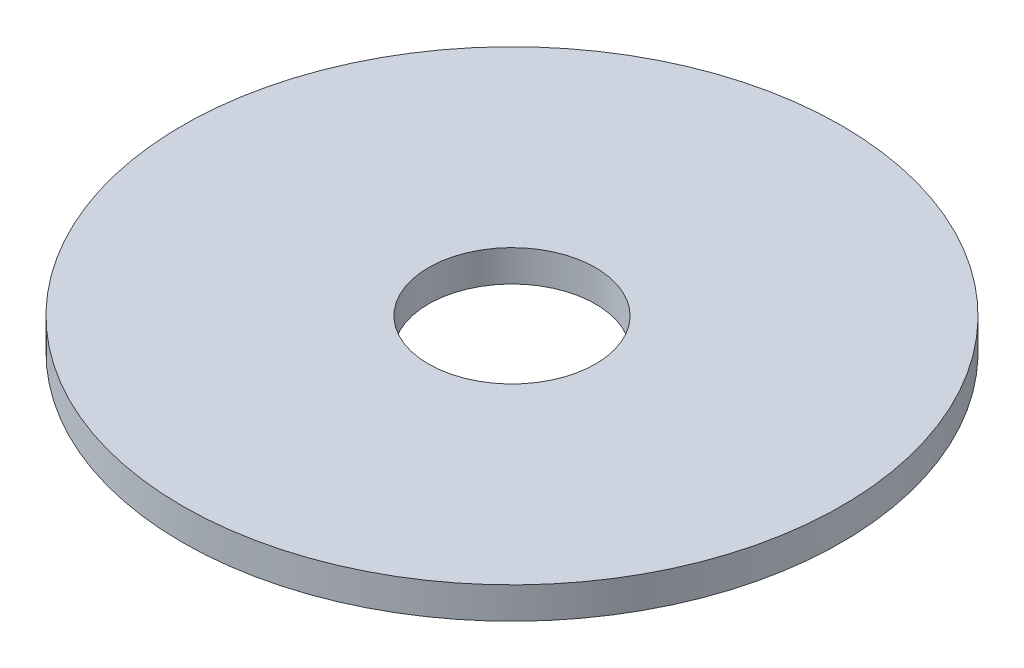
ISO-10303-21;
HEADER;
FILE_DESCRIPTION(('STEP AP214'),'2;1');
FILE_NAME('part.step','',(''),(''),'','','');
FILE_SCHEMA(('AUTOMOTIVE_DESIGN { 1 0 10303 214 1 1 1 1 }'));
ENDSEC;
DATA;
#1=APPLICATION_CONTEXT('core data for automotive mechanical design processes');
#2=APPLICATION_PROTOCOL_DEFINITION('international standard','automotive_design',2000,#1);
#3=PRODUCT_CONTEXT('',#1,'mechanical');
#4=PRODUCT('Part','Part','',(#3));
#5=PRODUCT_RELATED_PRODUCT_CATEGORY('part','',(#4));
#6=PRODUCT_DEFINITION_FORMATION('','',#4);
#7=PRODUCT_DEFINITION_CONTEXT('part definition',#1,'design');
#8=PRODUCT_DEFINITION('design','',#6,#7);
#9=PRODUCT_DEFINITION_SHAPE('','',#8);
#10=(LENGTH_UNIT() NAMED_UNIT(*) SI_UNIT(.MILLI.,.METRE.));
#11=(NAMED_UNIT(*) PLANE_ANGLE_UNIT() SI_UNIT($,.RADIAN.));
#12=(NAMED_UNIT(*) SI_UNIT($,.STERADIAN.) SOLID_ANGLE_UNIT());
#13=UNCERTAINTY_MEASURE_WITH_UNIT(LENGTH_MEASURE(1.E-05),#10,'distance_accuracy_value','');
#14=(GEOMETRIC_REPRESENTATION_CONTEXT(3) GLOBAL_UNCERTAINTY_ASSIGNED_CONTEXT((#13)) GLOBAL_UNIT_ASSIGNED_CONTEXT((#10,
#11,#12)) REPRESENTATION_CONTEXT('',''));
#15=CARTESIAN_POINT('',(0.,0.,0.));
#16=DIRECTION('',(0.,0.,1.));
#17=DIRECTION('',(1.,0.,0.));
#18=AXIS2_PLACEMENT_3D('',#15,#16,#17);
#19=CARTESIAN_POINT('',(0.,10.,0.));
#20=DIRECTION('',(0.,1.,0.));
#21=DIRECTION('',(0.,0.,1.));
#22=AXIS2_PLACEMENT_3D('',#19,#20,#21);
#23=PLANE('',#22);
#24=CARTESIAN_POINT('',(0.,10.,0.));
#25=DIRECTION('',(0.,1.,0.));
#26=DIRECTION('',(0.,0.,1.));
#27=AXIS2_PLACEMENT_3D('',#24,#25,#26);
#28=CIRCLE('',#27,104.55);
#29=CARTESIAN_POINT('',(0.,10.,104.55));
#30=VERTEX_POINT('',#29);
#31=EDGE_CURVE('E10',#30,#30,#28,.T.);
#32=ORIENTED_EDGE('',*,*,#31,.T.);
#33=EDGE_LOOP('',(#32));
#34=FACE_BOUND('',#33,.T.);
#35=CARTESIAN_POINT('',(0.,10.,0.));
#36=DIRECTION('',(0.,1.,0.));
#37=DIRECTION('',(0.,0.,1.));
#38=AXIS2_PLACEMENT_3D('',#35,#36,#37);
#39=CIRCLE('',#38,26.5);
#40=CARTESIAN_POINT('',(0.,10.,26.5));
#41=VERTEX_POINT('',#40);
#42=EDGE_CURVE('E47',#41,#41,#39,.T.);
#43=ORIENTED_EDGE('',*,*,#42,.F.);
#44=EDGE_LOOP('',(#43));
#45=FACE_BOUND('',#44,.T.);
#46=ADVANCED_FACE('F33',(#34,#45),#23,.T.);
#47=CARTESIAN_POINT('',(0.,0.,0.));
#48=DIRECTION('',(0.,1.,0.));
#49=DIRECTION('',(0.,0.,1.));
#50=AXIS2_PLACEMENT_3D('',#47,#48,#49);
#51=PLANE('',#50);
#52=CARTESIAN_POINT('',(0.,0.,0.));
#53=DIRECTION('',(0.,1.,0.));
#54=DIRECTION('',(0.,0.,1.));
#55=AXIS2_PLACEMENT_3D('',#52,#53,#54);
#56=CIRCLE('',#55,104.55);
#57=CARTESIAN_POINT('',(0.,0.,104.55));
#58=VERTEX_POINT('',#57);
#59=EDGE_CURVE('E37',#58,#58,#56,.T.);
#60=ORIENTED_EDGE('',*,*,#59,.F.);
#61=EDGE_LOOP('',(#60));
#62=FACE_BOUND('',#61,.T.);
#63=CARTESIAN_POINT('',(0.,0.,0.));
#64=DIRECTION('',(0.,1.,0.));
#65=DIRECTION('',(0.,0.,1.));
#66=AXIS2_PLACEMENT_3D('',#63,#64,#65);
#67=CIRCLE('',#66,26.5);
#68=CARTESIAN_POINT('',(0.,0.,26.5));
#69=VERTEX_POINT('',#68);
#70=EDGE_CURVE('E49',#69,#69,#67,.T.);
#71=ORIENTED_EDGE('',*,*,#70,.T.);
#72=EDGE_LOOP('',(#71));
#73=FACE_BOUND('',#72,.T.);
#74=ADVANCED_FACE('F62',(#62,#73),#51,.F.);
#75=CARTESIAN_POINT('',(0.,10.,0.));
#76=DIRECTION('',(0.,-1.,0.));
#77=DIRECTION('',(0.,0.,-1.));
#78=AXIS2_PLACEMENT_3D('',#75,#76,#77);
#79=CYLINDRICAL_SURFACE('',#78,104.55);
#80=ORIENTED_EDGE('',*,*,#31,.F.);
#81=EDGE_LOOP('',(#80));
#82=FACE_BOUND('',#81,.T.);
#83=ORIENTED_EDGE('',*,*,#59,.T.);
#84=EDGE_LOOP('',(#83));
#85=FACE_BOUND('',#84,.T.);
#86=ADVANCED_FACE('F35',(#82,#85),#79,.T.);
#87=CARTESIAN_POINT('',(0.,10.,0.));
#88=DIRECTION('',(0.,-1.,0.));
#89=DIRECTION('',(0.,0.,-1.));
#90=AXIS2_PLACEMENT_3D('',#87,#88,#89);
#91=CYLINDRICAL_SURFACE('',#90,26.5);
#92=ORIENTED_EDGE('',*,*,#42,.T.);
#93=EDGE_LOOP('',(#92));
#94=FACE_BOUND('',#93,.T.);
#95=ORIENTED_EDGE('',*,*,#70,.F.);
#96=EDGE_LOOP('',(#95));
#97=FACE_BOUND('',#96,.T.);
#98=ADVANCED_FACE('F58',(#94,#97),#91,.F.);
#99=CLOSED_SHELL('',(#46,#74,#86,#98));
#100=MANIFOLD_SOLID_BREP('B2',#99);
#101=ADVANCED_BREP_SHAPE_REPRESENTATION('',(#18,#100),#14);
#102=SHAPE_DEFINITION_REPRESENTATION(#9,#101);
ENDSEC;
END-ISO-10303-21;
